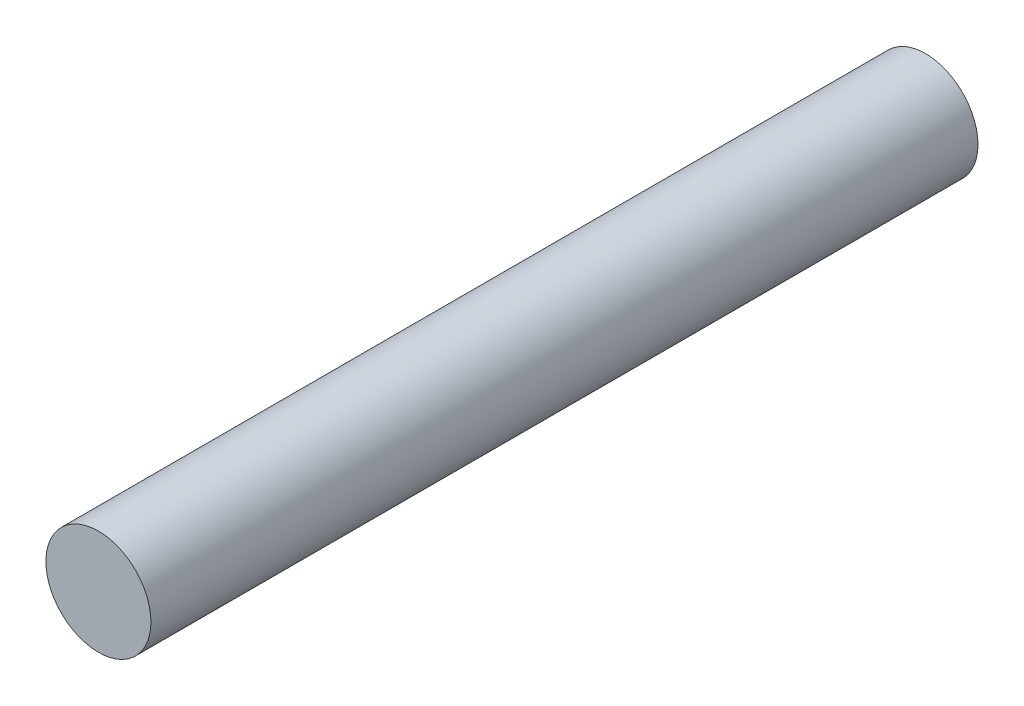
ISO-10303-21;
HEADER;
FILE_DESCRIPTION(('STEP AP214'),'2;1');
FILE_NAME('part.step','',(''),(''),'','','');
FILE_SCHEMA(('AUTOMOTIVE_DESIGN { 1 0 10303 214 1 1 1 1 }'));
ENDSEC;
DATA;
#1=APPLICATION_CONTEXT('core data for automotive mechanical design processes');
#2=APPLICATION_PROTOCOL_DEFINITION('international standard','automotive_design',2000,#1);
#3=PRODUCT_CONTEXT('',#1,'mechanical');
#4=PRODUCT('Part','Part','',(#3));
#5=PRODUCT_RELATED_PRODUCT_CATEGORY('part','',(#4));
#6=PRODUCT_DEFINITION_FORMATION('','',#4);
#7=PRODUCT_DEFINITION_CONTEXT('part definition',#1,'design');
#8=PRODUCT_DEFINITION('design','',#6,#7);
#9=PRODUCT_DEFINITION_SHAPE('','',#8);
#10=(LENGTH_UNIT() NAMED_UNIT(*) SI_UNIT(.MILLI.,.METRE.));
#11=(NAMED_UNIT(*) PLANE_ANGLE_UNIT() SI_UNIT($,.RADIAN.));
#12=(NAMED_UNIT(*) SI_UNIT($,.STERADIAN.) SOLID_ANGLE_UNIT());
#13=UNCERTAINTY_MEASURE_WITH_UNIT(LENGTH_MEASURE(1.E-05),#10,'distance_accuracy_value','');
#14=(GEOMETRIC_REPRESENTATION_CONTEXT(3) GLOBAL_UNCERTAINTY_ASSIGNED_CONTEXT((#13)) GLOBAL_UNIT_ASSIGNED_CONTEXT((#10,
#11,#12)) REPRESENTATION_CONTEXT('',''));
#15=CARTESIAN_POINT('',(0.,0.,0.));
#16=DIRECTION('',(0.,0.,1.));
#17=DIRECTION('',(1.,0.,0.));
#18=AXIS2_PLACEMENT_3D('',#15,#16,#17);
#19=CARTESIAN_POINT('',(0.,0.,25.));
#20=DIRECTION('',(0.,0.,-1.));
#21=DIRECTION('',(-1.,0.,0.));
#22=AXIS2_PLACEMENT_3D('',#19,#20,#21);
#23=CYLINDRICAL_SURFACE('',#22,3.175);
#24=CARTESIAN_POINT('',(0.,0.,25.));
#25=DIRECTION('',(0.,0.,1.));
#26=DIRECTION('',(1.,0.,0.));
#27=AXIS2_PLACEMENT_3D('',#24,#25,#26);
#28=CIRCLE('',#27,3.175);
#29=CARTESIAN_POINT('',(3.175,0.,25.));
#30=VERTEX_POINT('',#29);
#31=EDGE_CURVE('E10',#30,#30,#28,.T.);
#32=ORIENTED_EDGE('',*,*,#31,.F.);
#33=EDGE_LOOP('',(#32));
#34=FACE_BOUND('',#33,.T.);
#35=CARTESIAN_POINT('',(0.,0.,-25.));
#36=DIRECTION('',(0.,0.,1.));
#37=DIRECTION('',(1.,0.,0.));
#38=AXIS2_PLACEMENT_3D('',#35,#36,#37);
#39=CIRCLE('',#38,3.175);
#40=CARTESIAN_POINT('',(3.175,0.,-25.));
#41=VERTEX_POINT('',#40);
#42=EDGE_CURVE('E40',#41,#41,#39,.T.);
#43=ORIENTED_EDGE('',*,*,#42,.T.);
#44=EDGE_LOOP('',(#43));
#45=FACE_BOUND('',#44,.T.);
#46=ADVANCED_FACE('F37',(#34,#45),#23,.T.);
#47=CARTESIAN_POINT('',(0.,0.,25.));
#48=DIRECTION('',(0.,0.,1.));
#49=DIRECTION('',(1.,0.,0.));
#50=AXIS2_PLACEMENT_3D('',#47,#48,#49);
#51=PLANE('',#50);
#52=ORIENTED_EDGE('',*,*,#31,.T.);
#53=EDGE_LOOP('',(#52));
#54=FACE_BOUND('',#53,.T.);
#55=ADVANCED_FACE('F54',(#54),#51,.T.);
#56=CARTESIAN_POINT('',(0.,0.,-25.));
#57=DIRECTION('',(0.,0.,1.));
#58=DIRECTION('',(1.,0.,0.));
#59=AXIS2_PLACEMENT_3D('',#56,#57,#58);
#60=PLANE('',#59);
#61=ORIENTED_EDGE('',*,*,#42,.F.);
#62=EDGE_LOOP('',(#61));
#63=FACE_BOUND('',#62,.T.);
#64=ADVANCED_FACE('F52',(#63),#60,.F.);
#65=CLOSED_SHELL('',(#46,#55,#64));
#66=MANIFOLD_SOLID_BREP('B2',#65);
#67=ADVANCED_BREP_SHAPE_REPRESENTATION('',(#18,#66),#14);
#68=SHAPE_DEFINITION_REPRESENTATION(#9,#67);
ENDSEC;
END-ISO-10303-21;
